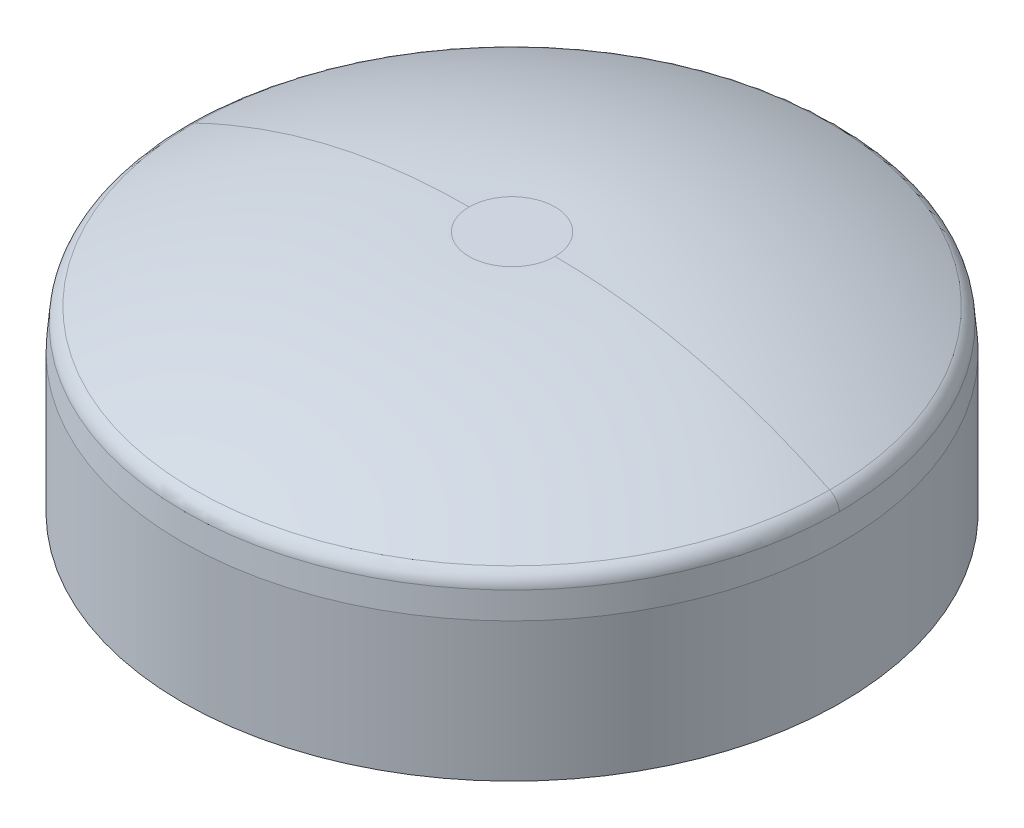
ISO-10303-21;
HEADER;
FILE_DESCRIPTION(('STEP AP214'),'2;1');
FILE_NAME('part.step','',(''),(''),'','','');
FILE_SCHEMA(('AUTOMOTIVE_DESIGN { 1 0 10303 214 1 1 1 1 }'));
ENDSEC;
DATA;
#1=APPLICATION_CONTEXT('core data for automotive mechanical design processes');
#2=APPLICATION_PROTOCOL_DEFINITION('international standard','automotive_design',2000,#1);
#3=PRODUCT_CONTEXT('',#1,'mechanical');
#4=PRODUCT('Part','Part','',(#3));
#5=PRODUCT_RELATED_PRODUCT_CATEGORY('part','',(#4));
#6=PRODUCT_DEFINITION_FORMATION('','',#4);
#7=PRODUCT_DEFINITION_CONTEXT('part definition',#1,'design');
#8=PRODUCT_DEFINITION('design','',#6,#7);
#9=PRODUCT_DEFINITION_SHAPE('','',#8);
#10=(LENGTH_UNIT() NAMED_UNIT(*) SI_UNIT(.MILLI.,.METRE.));
#11=(NAMED_UNIT(*) PLANE_ANGLE_UNIT() SI_UNIT($,.RADIAN.));
#12=(NAMED_UNIT(*) SI_UNIT($,.STERADIAN.) SOLID_ANGLE_UNIT());
#13=UNCERTAINTY_MEASURE_WITH_UNIT(LENGTH_MEASURE(1.E-05),#10,'distance_accuracy_value','');
#14=(GEOMETRIC_REPRESENTATION_CONTEXT(3) GLOBAL_UNCERTAINTY_ASSIGNED_CONTEXT((#13)) GLOBAL_UNIT_ASSIGNED_CONTEXT((#10,
#11,#12)) REPRESENTATION_CONTEXT('',''));
#15=CARTESIAN_POINT('',(0.,0.,0.));
#16=DIRECTION('',(0.,0.,1.));
#17=DIRECTION('',(1.,0.,0.));
#18=AXIS2_PLACEMENT_3D('',#15,#16,#17);
#19=CARTESIAN_POINT('',(-12.82237324978,-24.,169.3590051929));
#20=DIRECTION('',(0.,1.,0.));
#21=DIRECTION('',(0.,0.,1.));
#22=AXIS2_PLACEMENT_3D('',#19,#20,#21);
#23=PLANE('',#22);
#24=CARTESIAN_POINT('',(-104.822373249806,-24.0000000127581,56.3590051930826));
#25=DIRECTION('',(6.513917525063E-12,-1.,-3.70628461016E-10));
#26=DIRECTION('',(0.999999999999995,6.51257786226469E-12,-9.84710912250887E-08));
#27=AXIS2_PLACEMENT_3D('',#24,#25,#26);
#28=CIRCLE('',#27,1.23753227060622);
#29=CARTESIAN_POINT('',(-103.584840979216,-24.0000000085058,56.3590051521871));
#30=VERTEX_POINT('',#29);
#31=CARTESIAN_POINT('',(-106.059905520337,-24.0000000085091,56.3590051578677));
#32=VERTEX_POINT('',#31);
#33=EDGE_CURVE('E297',#30,#32,#28,.T.);
#34=ORIENTED_EDGE('',*,*,#33,.F.);
#35=CARTESIAN_POINT('',(-104.822373249798,-24.0000000127642,56.3590051926341));
#36=DIRECTION('',(-2.569710696586E-12,-1.,3.636028584331E-10));
#37=DIRECTION('',(-1.,2.57082819638291E-12,5.30039171717061E-10));
#38=AXIS2_PLACEMENT_3D('',#35,#36,#37);
#39=CIRCLE('',#38,1.23753227050245);
#40=EDGE_CURVE('E86',#32,#30,#39,.T.);
#41=ORIENTED_EDGE('',*,*,#40,.F.);
#42=EDGE_LOOP('',(#34,#41));
#43=FACE_BOUND('',#42,.T.);
#44=ADVANCED_FACE('F17',(#43),#23,.T.);
#45=CARTESIAN_POINT('',(-103.6669129941,-24.00018933325,56.35900519323));
#46=CARTESIAN_POINT('',(-103.6395480695,-24.00006306328,56.35900519325));
#47=CARTESIAN_POINT('',(-100.8708979554,-23.99367645042,56.3590051947));
#48=CARTESIAN_POINT('',(-98.17994756486,-24.63421227514,56.35900519634));
#49=CARTESIAN_POINT('',(-95.5917585308,-25.90261987075,56.35900519815));
#50=(BOUNDED_CURVE() B_SPLINE_CURVE(3,(#45,#46,#47,#48,#49),.UNSPECIFIED.,.F.,
.F.) B_SPLINE_CURVE_WITH_KNOTS((4,1,4),(0.,0.009881110702158,1.),
.UNSPECIFIED.) CURVE() GEOMETRIC_REPRESENTATION_ITEM() RATIONAL_B_SPLINE_CURVE((1.,1.,1.,1.,1.)) REPRESENTATION_ITEM(''));
#51=CARTESIAN_POINT('',(-104.8223732498,-24.95137377984,56.35900519298));
#52=DIRECTION('',(2.569710696586E-12,1.,-3.636028584331E-10));
#53=AXIS1_PLACEMENT('',#51,#52);
#54=SURFACE_OF_REVOLUTION('',#50,#53);
#55=ORIENTED_EDGE('',*,*,#40,.T.);
#56=CARTESIAN_POINT('',(-95.6657002463787,-25.8665654701918,56.3590039683499));
#57=CARTESIAN_POINT('',(-95.9835614890786,-25.7123273559992,56.3590040108984));
#58=CARTESIAN_POINT('',(-96.3054629251801,-25.566303363066,56.3590040539838));
#59=CARTESIAN_POINT('',(-96.9517084872916,-25.2939747388173,56.3590041404736));
#60=CARTESIAN_POINT('',(-97.2759401814401,-25.1674029505789,56.3590041838631));
#61=CARTESIAN_POINT('',(-97.9268535749711,-24.9339628057314,56.3590042709622));
#62=CARTESIAN_POINT('',(-98.2534535296672,-24.8268672159984,56.3590043146609));
#63=CARTESIAN_POINT('',(-98.9090608728125,-24.632331215056,56.3590044023729));
#64=CARTESIAN_POINT('',(-99.2380152265647,-24.5447123415413,56.3590044463791));
#65=CARTESIAN_POINT('',(-99.898305284791,-24.3890805343731,56.3590045347026));
#66=CARTESIAN_POINT('',(-100.229612096211,-24.320945211953,56.3590045790161));
#67=CARTESIAN_POINT('',(-100.89458282631,-24.2042176834094,56.359004667951));
#68=CARTESIAN_POINT('',(-101.228236082837,-24.155564808314,56.3590047125711));
#69=CARTESIAN_POINT('',(-101.897881260288,-24.0777534994799,56.3590048021168));
#70=CARTESIAN_POINT('',(-102.233873686867,-24.0485994218849,56.3590048470424));
#71=CARTESIAN_POINT('',(-102.908191800731,-24.0096646366894,56.3590049371987));
#72=CARTESIAN_POINT('',(-103.246521533943,-23.9999538983848,56.3590049824299));
#73=CARTESIAN_POINT('',(-103.5848409792,-24.0000000127501,56.3590050276563));
#74=B_SPLINE_CURVE_WITH_KNOTS('',3,(#56,#57,#58,#59,#60,#61,#62,#63,#64,#65,#66,#67,#68,#69,#70,
#71,#72,#73),.UNSPECIFIED.,.F.,.F.,(4,2,2,2,2,2,2,2,4),(0.,1.05987163455491,2.10355270090094,
3.13414248908296,4.15485954660127,5.16901642217199,6.17999015169606,7.19118966320553,
8.20602160946177),.UNSPECIFIED.);
#75=CARTESIAN_POINT('',(-95.6657042404636,-25.8665737050406,56.3590039996265));
#76=VERTEX_POINT('',#75);
#77=EDGE_CURVE('E102',#76,#30,#74,.T.);
#78=ORIENTED_EDGE('',*,*,#77,.F.);
#79=CARTESIAN_POINT('',(-95.6657002403706,-25.8665654578078,56.3590051980983));
#80=CARTESIAN_POINT('',(-95.6656973948198,-25.8665668382302,56.3470180650651));
#81=CARTESIAN_POINT('',(-95.6657180883203,-25.8665682186528,56.3350309264453));
#82=CARTESIAN_POINT('',(-95.6658065525291,-25.8665709794993,56.311056811745));
#83=CARTESIAN_POINT('',(-95.6658743232815,-25.8665723599234,56.2990698356646));
#84=CARTESIAN_POINT('',(-95.6660569411903,-25.866575120773,56.275096230931));
#85=CARTESIAN_POINT('',(-95.6661717883906,-25.8665765011986,56.2631096022781));
#86=CARTESIAN_POINT('',(-95.6664485574699,-25.8665792620513,56.2391368772819));
#87=CARTESIAN_POINT('',(-95.6666104793927,-25.8665806424785,56.2271507809389));
#88=CARTESIAN_POINT('',(-95.6669813955212,-25.8665834033342,56.2031793054371));
#89=CARTESIAN_POINT('',(-95.6671903897707,-25.8665847837629,56.1911939262789));
#90=CARTESIAN_POINT('',(-95.6676554474028,-25.8665875446217,56.1672240700098));
#91=CARTESIAN_POINT('',(-95.6679115108293,-25.8665889250519,56.1552395928999));
#92=CARTESIAN_POINT('',(-95.6684707029956,-25.8665916859138,56.1312717255789));
#93=CARTESIAN_POINT('',(-95.6687738317792,-25.8665930663455,56.1192883353688));
#94=CARTESIAN_POINT('',(-95.6694271499185,-25.8665958272104,56.0953228266769));
#95=CARTESIAN_POINT('',(-95.669777339318,-25.8665972076437,56.0833407081964));
#96=CARTESIAN_POINT('',(-95.6701510564586,-25.866598588077,56.0713593235799));
#97=B_SPLINE_CURVE_WITH_KNOTS('',3,(#79,#80,#81,#82,#83,#84,#85,#86,#87,#88,#89,#90,#91,#92,#93,
#94,#95,#96),.UNSPECIFIED.,.F.,.F.,(4,2,2,2,2,2,2,2,4),(0.,0.0359613772386024,
0.0719227880019081,0.107884232289917,0.143845710102624,0.179807221440025,0.215768766302114,
0.25173034468889,0.287691956600357),.UNSPECIFIED.);
#98=CARTESIAN_POINT('',(-95.670140011298,-25.8665753712645,56.0713589761788));
#99=VERTEX_POINT('',#98);
#100=EDGE_CURVE('E71',#76,#99,#97,.T.);
#101=ORIENTED_EDGE('',*,*,#100,.T.);
#102=CARTESIAN_POINT('',(-104.822373134536,-25.866549029672,56.3589938591116));
#103=DIRECTION('',(5.0998655764031E-08,-0.99999999992952,1.18725753794502E-05));
#104=DIRECTION('',(-0.99999999999939,-5.09855588366651E-08,1.10313565425801E-06));
#105=AXIS2_PLACEMENT_3D('',#102,#103,#104);
#106=CIRCLE('',#105,9.15676255837184);
#107=CARTESIAN_POINT('',(-113.979109670933,-25.8666063214221,56.3590039971683));
#108=VERTEX_POINT('',#107);
#109=EDGE_CURVE('E84',#108,#99,#106,.T.);
#110=ORIENTED_EDGE('',*,*,#109,.F.);
#111=CARTESIAN_POINT('',(-106.059905520412,-24.0000000127662,56.3590051924277));
#112=CARTESIAN_POINT('',(-106.398227864934,-23.999953896785,56.3590051922504));
#113=CARTESIAN_POINT('',(-106.736560497632,-24.0096648023086,56.3590051920693));
#114=CARTESIAN_POINT('',(-107.410884370189,-24.0486002572147,56.3590051917009));
#115=CARTESIAN_POINT('',(-107.746879656081,-24.0777548360586,56.3590051915135));
#116=CARTESIAN_POINT('',(-108.416530511888,-24.1555674823072,56.3590051911327));
#117=CARTESIAN_POINT('',(-108.750186587344,-24.2042211945877,56.3590051909393));
#118=CARTESIAN_POINT('',(-109.415162915306,-24.3209507296143,56.3590051905462));
#119=CARTESIAN_POINT('',(-109.746472505001,-24.3890872245404,56.3590051903466));
#120=CARTESIAN_POINT('',(-110.406768080368,-24.5447217068034,56.3590051899415));
#121=CARTESIAN_POINT('',(-110.735725171504,-24.6323420880992,56.3590051897359));
#122=CARTESIAN_POINT('',(-111.391337950982,-24.8268814327427,56.3590051893188));
#123=CARTESIAN_POINT('',(-111.717940602114,-24.9339788652591,56.3590051891073));
#124=CARTESIAN_POINT('',(-112.368859350778,-25.1674230222407,56.3590051886784));
#125=CARTESIAN_POINT('',(-112.693093699952,-25.2939969879864,56.359005188461));
#126=CARTESIAN_POINT('',(-113.339344536965,-25.5663302927161,56.3590051880205));
#127=CARTESIAN_POINT('',(-113.661248588126,-25.7123567976597,56.3590051877974));
#128=CARTESIAN_POINT('',(-113.979112352074,-25.8665975375128,56.3590051875734));
#129=B_SPLINE_CURVE_WITH_KNOTS('',3,(#111,#112,#113,#114,#115,#116,#117,#118,#119,#120,#121,
#122,#123,#124,#125,#126,#127,#128),.UNSPECIFIED.,.F.,.F.,(4,2,2,2,2,2,2,2,4),(0.,
1.01484064068061,2.02604881339111,3.03703125888376,4.05119699266849,5.07192313616448,
6.10252232032214,7.14621317047218,8.20609504922588),.UNSPECIFIED.);
#130=EDGE_CURVE('E264',#32,#108,#129,.T.);
#131=ORIENTED_EDGE('',*,*,#130,.F.);
#132=EDGE_LOOP('',(#55,#78,#101,#110,#131));
#133=FACE_BOUND('',#132,.T.);
#134=ADVANCED_FACE('F104',(#133),#54,.F.);
#135=CARTESIAN_POINT('',(-105.9778328185,-24.00018933647,56.35900519248));
#136=CARTESIAN_POINT('',(-106.0051979722,-24.00006306435,56.35900519246));
#137=CARTESIAN_POINT('',(-108.7738566148,-23.9936763768,56.35900519102));
#138=CARTESIAN_POINT('',(-111.4648153671,-24.63421626762,56.35900518937));
#139=CARTESIAN_POINT('',(-114.0530123856,-25.90263184802,56.35900518755));
#140=(BOUNDED_CURVE() B_SPLINE_CURVE(3,(#135,#136,#137,#138,#139),.UNSPECIFIED.,.F.,
.F.) B_SPLINE_CURVE_WITH_KNOTS((4,1,4),(0.,0.009881162982011,1.),
.UNSPECIFIED.) CURVE() GEOMETRIC_REPRESENTATION_ITEM() RATIONAL_B_SPLINE_CURVE((1.,1.,1.,1.,1.)) REPRESENTATION_ITEM(''));
#141=CARTESIAN_POINT('',(-104.8223732498,-24.9513738218,56.35900519273));
#142=DIRECTION('',(-6.513917525063E-12,1.,3.70628461016E-10));
#143=AXIS1_PLACEMENT('',#141,#142);
#144=SURFACE_OF_REVOLUTION('',#140,#143);
#145=CARTESIAN_POINT('',(-95.6657296152279,-25.8666259635535,56.359003969138));
#146=CARTESIAN_POINT('',(-95.6657259803936,-25.8666242165757,56.5073310720483));
#147=CARTESIAN_POINT('',(-95.6693324287154,-25.8666224693866,56.6556579318961));
#148=CARTESIAN_POINT('',(-95.6837435718316,-25.8666189791242,56.9519616125187));
#149=CARTESIAN_POINT('',(-95.6945482674908,-25.8666172360509,57.0999384332515));
#150=CARTESIAN_POINT('',(-95.7233339871613,-25.8666137585579,57.3951924646238));
#151=CARTESIAN_POINT('',(-95.7413150120348,-25.8666120241382,57.5424696751793));
#152=CARTESIAN_POINT('',(-95.784409973471,-25.8666085684677,57.8359767884855));
#153=CARTESIAN_POINT('',(-95.8095239108905,-25.8666068472168,57.9822066911104));
#154=CARTESIAN_POINT('',(-95.8668256591019,-25.8666034223685,58.2732739042647));
#155=CARTESIAN_POINT('',(-95.8990134707436,-25.8666017187711,58.4181112146269));
#156=CARTESIAN_POINT('',(-95.9703868995828,-25.8665983336725,58.706051262912));
#157=CARTESIAN_POINT('',(-96.0095725176211,-25.8665966521713,58.8491540006266));
#158=CARTESIAN_POINT('',(-96.0948490561232,-25.8665933156558,59.1332870145247));
#159=CARTESIAN_POINT('',(-96.1409399774166,-25.8665916606415,59.2743172904592));
#160=CARTESIAN_POINT('',(-96.2399182913084,-25.8665883814279,59.5539723861698));
#161=CARTESIAN_POINT('',(-96.2928056847232,-25.8665867572286,59.6925972056568));
#162=CARTESIAN_POINT('',(-96.4052520704757,-25.8665835439004,59.967114073115));
#163=CARTESIAN_POINT('',(-96.4648110636147,-25.8665819547716,60.1030061207579));
#164=CARTESIAN_POINT('',(-96.5904600220356,-25.8665788157568,60.3717365816723));
#165=CARTESIAN_POINT('',(-96.6565499881019,-25.8665772658708,60.504574994577));
#166=CARTESIAN_POINT('',(-96.7951048453743,-25.8665742094219,60.7668845331659));
#167=CARTESIAN_POINT('',(-96.8675697373462,-25.8665727028588,60.8963556584456));
#168=CARTESIAN_POINT('',(-97.0187033470786,-25.8665697370332,61.1516249195549));
#169=CARTESIAN_POINT('',(-97.0973720655844,-25.8665682777707,61.2774230549432));
#170=CARTESIAN_POINT('',(-97.2607275808276,-25.866565410412,61.525049306464));
#171=CARTESIAN_POINT('',(-97.345414378288,-25.8665640023159,61.6468774221196));
#172=CARTESIAN_POINT('',(-97.5206060942115,-25.8665612410352,61.8862759781312));
#173=CARTESIAN_POINT('',(-97.6111110133736,-25.8665598878506,62.0038464179758));
#174=CARTESIAN_POINT('',(-97.7977252779375,-25.8665572400086,62.2344520192859));
#175=CARTESIAN_POINT('',(-97.8938346240127,-25.866555945351,62.3474871802065));
#176=CARTESIAN_POINT('',(-98.0914308146662,-25.8665534180404,62.5687553290199));
#177=CARTESIAN_POINT('',(-98.1929176598905,-25.8665521853872,62.6769883163358));
#178=CARTESIAN_POINT('',(-98.401029223941,-25.8665497854161,62.8883965619039));
#179=CARTESIAN_POINT('',(-98.5076539433844,-25.8665486180981,62.9915718195486));
#180=CARTESIAN_POINT('',(-98.7257894995959,-25.8665463519741,63.1926209917621));
#181=CARTESIAN_POINT('',(-98.8373003369509,-25.866545253168,63.290494905694));
#182=CARTESIAN_POINT('',(-99.0649448357651,-25.8665431270826,63.4807102937065));
#183=CARTESIAN_POINT('',(-99.1810784977795,-25.8665420998033,63.5730517671224));
#184=CARTESIAN_POINT('',(-99.4176944374222,-25.8665401196173,63.7519842402224));
#185=CARTESIAN_POINT('',(-99.5381767155728,-25.8665391667106,63.8385752392157));
#186=CARTESIAN_POINT('',(-99.7832054111738,-25.8665373379404,64.0058023073006));
#187=CARTESIAN_POINT('',(-99.9077518291125,-25.8665364620768,64.0864383756767));
#188=CARTESIAN_POINT('',(-100.160614731843,-25.8665347898813,64.2415651868235));
#189=CARTESIAN_POINT('',(-100.288931217087,-25.8665339935493,64.3160559288558));
#190=CARTESIAN_POINT('',(-100.549031280197,-25.8665324827175,64.4587162016348));
#191=CARTESIAN_POINT('',(-100.680814858479,-25.8665317682178,64.5268857316221));
#192=CARTESIAN_POINT('',(-100.947537947015,-25.866530423158,64.6567426199513));
#193=CARTESIAN_POINT('',(-101.082477457648,-25.8665297925979,64.7184299775145));
#194=CARTESIAN_POINT('',(-101.355193798515,-25.8665286173268,64.8351768660123));
#195=CARTESIAN_POINT('',(-101.49297062909,-25.8665280726158,64.8902363961508));
#196=CARTESIAN_POINT('',(-101.771036298042,-25.8665270707493,64.9935976241103));
#197=CARTESIAN_POINT('',(-101.911325136721,-25.8665266135938,65.0418993211195));
#198=CARTESIAN_POINT('',(-102.194083578762,-25.8665257883383,65.1316308333932));
#199=CARTESIAN_POINT('',(-102.336553182386,-25.8665254202383,65.1730606478322));
#200=CARTESIAN_POINT('',(-102.623336761994,-25.8665247743832,65.2489505710923));
#201=CARTESIAN_POINT('',(-102.7676507382,-25.8665244966282,65.283410679076));
#202=CARTESIAN_POINT('',(-103.057782315718,-25.8665240325394,65.3452798220875));
#203=CARTESIAN_POINT('',(-103.203599917212,-25.8665238462056,65.3726888562682));
#204=CARTESIAN_POINT('',(-103.496394447677,-25.8665235658198,65.4203911329954));
#205=CARTESIAN_POINT('',(-103.643371376788,-25.8665234717677,65.4406843746871));
#206=CARTESIAN_POINT('',(-103.938137527425,-25.8665233765877,65.4741071492335));
#207=CARTESIAN_POINT('',(-104.085926749049,-25.8665233754598,65.4872366812275));
#208=CARTESIAN_POINT('',(-104.381968531617,-25.8665234665513,65.5063010337944));
#209=CARTESIAN_POINT('',(-104.530221092617,-25.8665235587707,65.512235853503));
#210=CARTESIAN_POINT('',(-104.826839506741,-25.8665238367595,65.5168967667397));
#211=CARTESIAN_POINT('',(-104.975205359878,-25.8665240225289,65.5156228594019));
#212=CARTESIAN_POINT('',(-105.271700043498,-25.8665244875995,65.5058693247069));
#213=CARTESIAN_POINT('',(-105.419828873952,-25.8665247669007,65.4973896964841));
#214=CARTESIAN_POINT('',(-105.715499756988,-25.8665254187959,65.473244740006));
#215=CARTESIAN_POINT('',(-105.863041809499,-25.8665257913899,65.4575794108876));
#216=CARTESIAN_POINT('',(-106.157190766823,-25.8665266294114,65.4191000391653));
#217=CARTESIAN_POINT('',(-106.303797671523,-25.866527094839,65.3962859957027));
#218=CARTESIAN_POINT('',(-106.595730171343,-25.866528117849,65.3435630610721));
#219=CARTESIAN_POINT('',(-106.741055766309,-25.8665286754316,65.3136541690517));
#220=CARTESIAN_POINT('',(-107.030082510066,-25.8665298818555,65.2468121551371));
#221=CARTESIAN_POINT('',(-107.173783658663,-25.866530530697,65.209879032399));
#222=CARTESIAN_POINT('',(-107.459222208577,-25.8665319185273,65.1290757601965));
#223=CARTESIAN_POINT('',(-107.600959609658,-25.8665326575162,65.0852056098987));
#224=CARTESIAN_POINT('',(-107.882136000065,-25.8665342243168,64.9906318651439));
#225=CARTESIAN_POINT('',(-108.021574989115,-25.8665350521286,64.9399282698659));
#226=CARTESIAN_POINT('',(-108.297825317813,-25.8665367950411,64.8318073525671));
#227=CARTESIAN_POINT('',(-108.434636657145,-25.8665377101418,64.7743900297397));
#228=CARTESIAN_POINT('',(-108.70530865297,-25.8665396258917,64.6529772269398));
#229=CARTESIAN_POINT('',(-108.839169309107,-25.866540626541,64.5889817461771));
#230=CARTESIAN_POINT('',(-109.103623872047,-25.8665427114459,64.4545637291888));
#231=CARTESIAN_POINT('',(-109.234217778458,-25.8665437957016,64.3841411921912));
#232=CARTESIAN_POINT('',(-109.491830488676,-25.8665460456797,64.2370353397291));
#233=CARTESIAN_POINT('',(-109.618849292055,-25.8665472114022,64.1603520235125));
#234=CARTESIAN_POINT('',(-109.869011884242,-25.8665496219819,64.0009056723197));
#235=CARTESIAN_POINT('',(-109.992155672585,-25.8665508668391,63.9181426366131));
#236=CARTESIAN_POINT('',(-110.234277472172,-25.8665534331695,63.7467322613527));
#237=CARTESIAN_POINT('',(-110.353255482915,-25.8665547546427,63.6580849210919));
#238=CARTESIAN_POINT('',(-110.586764800753,-25.8665574715053,63.4751152454384));
#239=CARTESIAN_POINT('',(-110.701296107313,-25.8665588668948,63.3807929093639));
#240=CARTESIAN_POINT('',(-110.925641589523,-25.8665617287156,63.1866959503949));
#241=CARTESIAN_POINT('',(-111.035455764607,-25.866563195147,63.0869213268453));
#242=CARTESIAN_POINT('',(-111.250107694421,-25.8665661960097,62.8821553749881));
#243=CARTESIAN_POINT('',(-111.354945448553,-25.8665677304411,62.7771640460539));
#244=CARTESIAN_POINT('',(-111.559396997058,-25.8665708641013,62.5622125829972));
#245=CARTESIAN_POINT('',(-111.659010790803,-25.8665724633301,62.452252448278));
#246=CARTESIAN_POINT('',(-111.852779213652,-25.8665757232296,62.2276230054025));
#247=CARTESIAN_POINT('',(-111.946933842099,-25.8665773839002,62.1129536966805));
#248=CARTESIAN_POINT('',(-112.129561619349,-25.8665807631829,61.879176656704));
#249=CARTESIAN_POINT('',(-112.218034767468,-25.8665824817948,61.7600689249161));
#250=CARTESIAN_POINT('',(-112.389090683861,-25.8665859733225,61.5176962695826));
#251=CARTESIAN_POINT('',(-112.471673451427,-25.8665877462383,61.3944313455376));
#252=CARTESIAN_POINT('',(-112.630753614572,-25.866591342608,61.1440353523089));
#253=CARTESIAN_POINT('',(-112.70725100942,-25.8665931660619,61.0169042826609));
#254=CARTESIAN_POINT('',(-112.853979803419,-25.866596859623,60.7590761734829));
#255=CARTESIAN_POINT('',(-112.924211201818,-25.8665987297302,60.6283791335245));
#256=CARTESIAN_POINT('',(-113.058242174276,-25.8666025126026,60.3637276788732));
#257=CARTESIAN_POINT('',(-113.122041747562,-25.8666044253679,60.2297732637891));
#258=CARTESIAN_POINT('',(-113.243058427201,-25.8666082894606,59.9589233452404));
#259=CARTESIAN_POINT('',(-113.300275532762,-25.8666102407881,59.8220278414225));
#260=CARTESIAN_POINT('',(-113.407992178228,-25.8666141778183,59.5456189763379));
#261=CARTESIAN_POINT('',(-113.458491717326,-25.8666161635212,59.4061056147568));
#262=CARTESIAN_POINT('',(-113.55265398605,-25.8666201650341,59.1247904458204));
#263=CARTESIAN_POINT('',(-113.596316714856,-25.8666221808441,58.9829886381903));
#264=CARTESIAN_POINT('',(-113.67670228535,-25.8666262382324,58.6974313941643));
#265=CARTESIAN_POINT('',(-113.713425126205,-25.8666282798106,58.5536759575338));
#266=CARTESIAN_POINT('',(-113.779844141847,-25.8666323843352,58.2645508784068));
#267=CARTESIAN_POINT('',(-113.809540315789,-25.8666344472816,58.1191812357164));
#268=CARTESIAN_POINT('',(-113.861836135996,-25.8666385900918,57.8271710050057));
#269=CARTESIAN_POINT('',(-113.884435781408,-25.8666406699556,57.6805304168328));
#270=CARTESIAN_POINT('',(-113.922484221119,-25.8666448421114,57.3863244590303));
#271=CARTESIAN_POINT('',(-113.937933014558,-25.8666469344034,57.2387590892895));
#272=CARTESIAN_POINT('',(-113.96164685609,-25.8666511268918,56.943052280277));
#273=CARTESIAN_POINT('',(-113.96991190332,-25.8666532270882,56.7949108409361));
#274=CARTESIAN_POINT('',(-113.974568630466,-25.8666553289749,56.6466557318231));
#275=B_SPLINE_CURVE_WITH_KNOTS('',3,(#145,#146,#147,#148,#149,#150,#151,#152,#153,#154,#155,
#156,#157,#158,#159,#160,#161,#162,#163,#164,#165,#166,#167,#168,#169,#170,#171,#172,#173,#174,
#175,#176,#177,#178,#179,#180,#181,#182,#183,#184,#185,#186,#187,#188,#189,#190,#191,#192,#193,
#194,#195,#196,#197,#198,#199,#200,#201,#202,#203,#204,#205,#206,#207,#208,#209,#210,#211,#212,
#213,#214,#215,#216,#217,#218,#219,#220,#221,#222,#223,#224,#225,#226,#227,#228,#229,#230,#231,
#232,#233,#234,#235,#236,#237,#238,#239,#240,#241,#242,#243,#244,#245,#246,#247,#248,#249,#250,
#251,#252,#253,#254,#255,#256,#257,#258,#259,#260,#261,#262,#263,#264,#265,#266,#267,#268,#269,
#270,#271,#272,#273,#274),.UNSPECIFIED.,.F.,.F.,(4,2,2,2,2,2,2,2,2,2,2,2,2,2,2,2,2,2,2,2,2,2,2,
2,2,2,2,2,2,2,2,2,2,2,2,2,2,2,2,2,2,2,2,2,2,2,2,2,2,2,2,2,2,2,2,2,2,2,2,2,2,2,2,2,4),(0.,
0.444937091882204,0.889874237218907,1.33481143601005,1.77974868825555,2.22468599395536,
2.66962335310942,3.11456076571765,3.55949823178001,4.00443575129642,4.44937332426682,
4.89431095069114,5.33924863056931,5.78418636390131,6.22912415068701,6.67406199092641,
7.11899988461941,7.56393783176596,8.00887583236598,8.45381388641944,8.89875199392624,
9.34369015488631,9.78862836929964,10.2335666371661,10.6785049584857,11.1234433332583,
11.5683817614839,12.0133202431624,12.4582587782938,12.9031973668779,13.3481360089148,
13.7930747044043,14.2380134533464,14.682952255741,15.1278911115881,15.5728300208876,
16.0177689836395,16.4627079998436,16.9076470694999,17.3525861926084,17.7975253691689,
18.2424645991815,18.6874038826461,19.1323432195625,19.5772826099308,20.0222220537508,
20.4671615510226,20.9121011017459,21.3570407059209,21.8019803635474,22.2469200746253,
22.6918598391546,23.1367996571352,23.5817395285671,24.0266794534502,24.4716194317845,
24.9165594635697,25.361499548806,25.8064396874933,26.2513798796314,26.6963201252203,
27.14126042426,27.5862007767504,28.0311411826914,28.4760816420829),.UNSPECIFIED.);
#276=CARTESIAN_POINT('',(-113.974581590765,-25.8666267683767,56.646656138777));
#277=VERTEX_POINT('',#276);
#278=EDGE_CURVE('E94',#76,#277,#275,.T.);
#279=ORIENTED_EDGE('',*,*,#278,.F.);
#280=ORIENTED_EDGE('',*,*,#77,.T.);
#281=ORIENTED_EDGE('',*,*,#33,.T.);
#282=ORIENTED_EDGE('',*,*,#130,.T.);
#283=CARTESIAN_POINT('',(-104.822373249794,-25.8665975374531,56.3590051923908));
#284=DIRECTION('',(-6.513917525063E-12,1.,3.70628461016E-10));
#285=DIRECTION('',(-1.,-6.51397089419471E-12,-5.22991688522704E-10));
#286=AXIS2_PLACEMENT_3D('',#283,#284,#285);
#287=CIRCLE('',#286,9.15673910228);
#288=EDGE_CURVE('E111',#108,#277,#287,.T.);
#289=ORIENTED_EDGE('',*,*,#288,.T.);
#290=EDGE_LOOP('',(#279,#280,#281,#282,#289));
#291=FACE_BOUND('',#290,.T.);
#292=ADVANCED_FACE('F115',(#291),#144,.F.);
#293=CARTESIAN_POINT('',(-104.8223731116,-26.31628535645,56.35899919864));
#294=DIRECTION('',(-5.0998655764031E-08,0.99999999992952,-1.18725753794502E-05));
#295=DIRECTION('',(-0.99950651109874,3.21971728575085E-07,0.0314123267384211));
#296=AXIS2_PLACEMENT_3D('',#293,#294,#295);
#297=TOROIDAL_SURFACE('',#296,8.938275091027,0.4999995370388);
#298=CARTESIAN_POINT('',(-104.822373113822,-26.2727245296548,56.3589986814608));
#299=DIRECTION('',(-5.0998655764031E-08,0.99999999992952,-1.18725753794502E-05));
#300=DIRECTION('',(0.999506511096033,-3.21971729491601E-07,-0.0314123268245597));
#301=AXIS2_PLACEMENT_3D('',#298,#299,#300);
#302=CIRCLE('',#301,9.4363734662579);
#303=CARTESIAN_POINT('',(-104.8223732498,-26.2728365000765,46.9226244885346));
#304=VERTEX_POINT('',#303);
#305=CARTESIAN_POINT('',(-95.3906570213136,-26.2727276228835,56.062580253842));
#306=VERTEX_POINT('',#305);
#307=EDGE_CURVE('E217',#304,#306,#302,.F.);
#308=ORIENTED_EDGE('',*,*,#307,.F.);
#309=CARTESIAN_POINT('',(-104.8223732498,-26.2728365637098,46.922625215868));
#310=CARTESIAN_POINT('',(-104.976775782769,-26.2728381262622,46.9226218068865));
#311=CARTESIAN_POINT('',(-105.131178040317,-26.2728396437463,46.9264144382197));
#312=CARTESIAN_POINT('',(-105.439610748799,-26.2728425888387,46.9415682645383));
#313=CARTESIAN_POINT('',(-105.593641199718,-26.2728440164468,46.9529294598508));
#314=CARTESIAN_POINT('',(-105.900959032407,-26.2728467820473,46.9831968978012));
#315=CARTESIAN_POINT('',(-106.054246414144,-26.2728481200397,47.002103140765));
#316=CARTESIAN_POINT('',(-106.359708876043,-26.2728507069428,47.0474140953799));
#317=CARTESIAN_POINT('',(-106.511883956156,-26.2728519558536,47.073818807355));
#318=CARTESIAN_POINT('',(-106.81475519767,-26.2728543653268,47.1340633659596));
#319=CARTESIAN_POINT('',(-106.965451359006,-26.2728555258892,47.1679032129104));
#320=CARTESIAN_POINT('',(-107.265001725878,-26.2728577596159,47.2429364447485));
#321=CARTESIAN_POINT('',(-107.413855931334,-26.2728588327803,47.2841298299535));
#322=CARTESIAN_POINT('',(-107.709363782146,-26.2728608928705,47.373770920229));
#323=CARTESIAN_POINT('',(-107.856017427407,-26.2728618797964,47.4222186256128));
#324=CARTESIAN_POINT('',(-108.146770856082,-26.2728637687775,47.5262516366724));
#325=CARTESIAN_POINT('',(-108.290870639386,-26.2728646708328,47.5818369426565));
#326=CARTESIAN_POINT('',(-108.576169194525,-26.2728663916447,47.7000112469595));
#327=CARTESIAN_POINT('',(-108.717367966233,-26.2728672104014,47.7626002455809));
#328=CARTESIAN_POINT('',(-108.996524337412,-26.272868766389,47.8946311528563));
#329=CARTESIAN_POINT('',(-109.134481936742,-26.27286950362,47.9640730618063));
#330=CARTESIAN_POINT('',(-109.406823610618,-26.2728708985254,48.1096424986311));
#331=CARTESIAN_POINT('',(-109.54120768501,-26.2728715561999,48.1857700267945));
#332=CARTESIAN_POINT('',(-109.806078565384,-26.2728727941533,48.3445273045361));
#333=CARTESIAN_POINT('',(-109.936565371199,-26.2728733744322,48.4271570543951));
#334=CARTESIAN_POINT('',(-110.193327359634,-26.2728744599416,48.5987197135999));
#335=CARTESIAN_POINT('',(-110.319602542074,-26.2728749651723,48.6876526232179));
#336=CARTESIAN_POINT('',(-110.567637075129,-26.2728759031134,48.8716073551079));
#337=CARTESIAN_POINT('',(-110.689396425549,-26.2728763358239,48.9666291776427));
#338=CARTESIAN_POINT('',(-110.928105964952,-26.2728771314277,49.1625328197787));
#339=CARTESIAN_POINT('',(-111.045056153728,-26.272877494321,49.2634146396328));
#340=CARTESIAN_POINT('',(-111.273865625907,-26.2728781531613,49.4707952435388));
#341=CARTESIAN_POINT('',(-111.385724909091,-26.2728784491084,49.5772940278331));
#342=CARTESIAN_POINT('',(-111.604083090578,-26.2728789770887,49.7956519959576));
#343=CARTESIAN_POINT('',(-111.710581988649,-26.2728792091219,49.9075111800192));
#344=CARTESIAN_POINT('',(-111.917962834027,-26.2728796124608,50.1363204693094));
#345=CARTESIAN_POINT('',(-112.018844781091,-26.2728797837665,50.2532705747576));
#346=CARTESIAN_POINT('',(-112.214748690288,-26.2728800689829,50.4919799639414));
#347=CARTESIAN_POINT('',(-112.309770652169,-26.2728801828937,50.6137392478844));
#348=CARTESIAN_POINT('',(-112.493725674045,-26.2728803567912,50.8617736654104));
#349=CARTESIAN_POINT('',(-112.582658733777,-26.272880416778,50.9880487991882));
#350=CARTESIAN_POINT('',(-112.754221703094,-26.2728804864282,51.2448107086228));
#351=CARTESIAN_POINT('',(-112.836851612405,-26.2728804960918,51.3752974844612));
#352=CARTESIAN_POINT('',(-112.995609217462,-26.2728804688177,51.640168324005));
#353=CARTESIAN_POINT('',(-113.071736912927,-26.27288043188,51.7745523878785));
#354=CARTESIAN_POINT('',(-113.217306691238,-26.2728803152378,52.0468940605377));
#355=CARTESIAN_POINT('',(-113.286748773797,-26.2728802355333,52.1848516694774));
#356=CARTESIAN_POINT('',(-113.418780033602,-26.2728800372947,52.4640080802887));
#357=CARTESIAN_POINT('',(-113.481369210553,-26.2728799187607,52.6052068822999));
#358=CARTESIAN_POINT('',(-113.599543875214,-26.2728796468939,52.8905055189431));
#359=CARTESIAN_POINT('',(-113.655129362623,-26.2728794935613,53.0346053537003));
#360=CARTESIAN_POINT('',(-113.759162738585,-26.272879156212,53.3253589065575));
#361=CARTESIAN_POINT('',(-113.807610626832,-26.2728789721954,53.4720126247677));
#362=CARTESIAN_POINT('',(-113.897252083213,-26.2728785776669,53.7675206430201));
#363=CARTESIAN_POINT('',(-113.938445651035,-26.272878367155,53.9163749431571));
#364=CARTESIAN_POINT('',(-114.013479246798,-26.2728779238885,54.2159255210846));
#365=CARTESIAN_POINT('',(-114.047319274421,-26.2728776911339,54.3666217989544));
#366=CARTESIAN_POINT('',(-114.107564191354,-26.2728772076879,54.6694932952653));
#367=CARTESIAN_POINT('',(-114.133969080344,-26.2728769569965,54.8216685137701));
#368=CARTESIAN_POINT('',(-114.179280384263,-26.2728764420264,55.1271312741051));
#369=CARTESIAN_POINT('',(-114.19818679887,-26.2728761777477,55.2804188159831));
#370=CARTESIAN_POINT('',(-114.228454573672,-26.2728756399845,55.5877369904085));
#371=CARTESIAN_POINT('',(-114.239815933542,-26.2728753664999,55.7417676229879));
#372=CARTESIAN_POINT('',(-114.254970080849,-26.2728748147314,56.0502007159531));
#373=CARTESIAN_POINT('',(-114.258762867959,-26.2728745364476,56.2046031763549));
#374=CARTESIAN_POINT('',(-114.258759609839,-26.2728742579674,56.3590059158549));
#375=B_SPLINE_CURVE_WITH_KNOTS('',3,(#309,#310,#311,#312,#313,#314,#315,#316,#317,#318,#319,
#320,#321,#322,#323,#324,#325,#326,#327,#328,#329,#330,#331,#332,#333,#334,#335,#336,#337,#338,
#339,#340,#341,#342,#343,#344,#345,#346,#347,#348,#349,#350,#351,#352,#353,#354,#355,#356,#357,
#358,#359,#360,#361,#362,#363,#364,#365,#366,#367,#368,#369,#370,#371,#372,#373,#374),
.UNSPECIFIED.,.F.,.F.,(4,2,2,2,2,2,2,2,2,2,2,2,2,2,2,2,2,2,2,2,2,2,2,2,2,2,2,2,2,2,2,2,4),(0.,
0.463160627061759,0.926321274141121,1.38948194123589,1.85264262834396,2.31580333546315,
2.77896406259136,3.24212480972641,3.70528557686618,4.16844636400852,4.63160717115128,
5.09476799829231,5.55792884542948,6.02108971256064,6.48425059968368,6.9474115067964,
7.4105724338967,7.8737333809824,8.3368943480514,8.8000553351015,9.26321634213061,
9.72637736913656,10.1895384161172,10.6526994830704,11.1158605699941,11.579021676886,
12.042182803744,12.505343950566,12.9685051173499,13.4316663040934,13.8948275107945,
14.3579887374511,14.8211499840609),.UNSPECIFIED.);
#376=CARTESIAN_POINT('',(-114.25874981052,-26.2728746798238,56.3590059158592));
#377=VERTEX_POINT('',#376);
#378=EDGE_CURVE('E237',#377,#304,#375,.F.);
#379=ORIENTED_EDGE('',*,*,#378,.F.);
#380=CARTESIAN_POINT('',(-113.979084251549,-25.8666574755699,56.3590039616144));
#381=CARTESIAN_POINT('',(-113.983916687575,-25.8690045093654,56.3590039556285));
#382=CARTESIAN_POINT('',(-113.98871126716,-25.8714294825346,56.3590039506623));
#383=CARTESIAN_POINT('',(-113.998219798358,-25.8764326627283,56.3590039427448));
#384=CARTESIAN_POINT('',(-114.00293374997,-25.8790108697527,56.3590039397934));
#385=CARTESIAN_POINT('',(-114.012276110133,-25.8843178727647,56.3590039358808));
#386=CARTESIAN_POINT('',(-114.016904518682,-25.8870466687522,56.3590039349195));
#387=CARTESIAN_POINT('',(-114.026070988946,-25.8926520056927,56.3590039349597));
#388=CARTESIAN_POINT('',(-114.030609050659,-25.8955285466456,56.3590039359611));
#389=CARTESIAN_POINT('',(-114.039590111325,-25.9014263874546,56.3590039398978));
#390=CARTESIAN_POINT('',(-114.044033110277,-25.9044476873108,56.359003942833));
#391=CARTESIAN_POINT('',(-114.052819429869,-25.9106319064095,56.359003950606));
#392=CARTESIAN_POINT('',(-114.057162750509,-25.9137948256521,56.3590039554439));
#393=CARTESIAN_POINT('',(-114.065745201049,-25.9202589976974,56.3590039669894));
#394=CARTESIAN_POINT('',(-114.069984330949,-25.9235602505,56.359003973697));
#395=CARTESIAN_POINT('',(-114.078353995946,-25.9302976599023,56.3590039889473));
#396=CARTESIAN_POINT('',(-114.082484531042,-25.933733816502,56.35900399749));
#397=CARTESIAN_POINT('',(-114.090632715154,-25.940737463641,56.3590040163737));
#398=CARTESIAN_POINT('',(-114.094650364171,-25.9443049541803,56.3590040267147));
#399=CARTESIAN_POINT('',(-114.102568602134,-25.9515675628808,56.3590040491569));
#400=CARTESIAN_POINT('',(-114.106469191082,-25.955262681042,56.359004061258));
#401=CARTESIAN_POINT('',(-114.114149256533,-25.9627767060784,56.3590040871802));
#402=CARTESIAN_POINT('',(-114.117928733037,-25.9665956129537,56.3590041010012));
#403=CARTESIAN_POINT('',(-114.125362647051,-25.9743532479038,56.3590041303214));
#404=CARTESIAN_POINT('',(-114.129017084561,-25.9782919759786,56.3590041458205));
#405=CARTESIAN_POINT('',(-114.136197123943,-25.9862851613297,56.3590041784533));
#406=CARTESIAN_POINT('',(-114.139722725815,-25.9903396186059,56.359004195587));
#407=CARTESIAN_POINT('',(-114.146641431124,-25.9985600501289,56.3590042314439));
#408=CARTESIAN_POINT('',(-114.150034534562,-26.0027260243757,56.3590042501671));
#409=CARTESIAN_POINT('',(-114.156684717861,-26.0111651617523,56.3590042891561));
#410=CARTESIAN_POINT('',(-114.159941797724,-26.0154383248822,56.359004309422));
#411=CARTESIAN_POINT('',(-114.166316550048,-26.0240874005778,56.3590043514483));
#412=CARTESIAN_POINT('',(-114.16943422251,-26.0284633131435,56.3590043732087));
#413=CARTESIAN_POINT('',(-114.175526921042,-26.0373133415155,56.3590044181743));
#414=CARTESIAN_POINT('',(-114.178501947111,-26.0417874573218,56.3590044413794));
#415=CARTESIAN_POINT('',(-114.184306262063,-26.0508292439553,56.3590044891833));
#416=CARTESIAN_POINT('',(-114.187135550945,-26.0553969147825,56.3590045137821));
#417=CARTESIAN_POINT('',(-114.192645452134,-26.0646210660422,56.3590045643206));
#418=CARTESIAN_POINT('',(-114.195326064442,-26.0692775464748,56.3590045902604));
#419=CARTESIAN_POINT('',(-114.200535827558,-26.0786744792645,56.359004643427));
#420=CARTESIAN_POINT('',(-114.203064978367,-26.0834149316215,56.3590046706539));
#421=CARTESIAN_POINT('',(-114.207969190916,-26.0929748833397,56.3590047263396));
#422=CARTESIAN_POINT('',(-114.210344252657,-26.0977943827007,56.3590047547984));
#423=CARTESIAN_POINT('',(-114.214937819586,-26.1075074213834,56.3590048128915));
#424=CARTESIAN_POINT('',(-114.217156324774,-26.1124009607049,56.3590048425258));
#425=CARTESIAN_POINT('',(-114.221434473764,-26.1222569953439,56.3590049029124));
#426=CARTESIAN_POINT('',(-114.223494117565,-26.1272194906613,56.3590049336646));
#427=CARTESIAN_POINT('',(-114.227452403988,-26.1372082816881,56.3590049962283));
#428=CARTESIAN_POINT('',(-114.22935104661,-26.1422345773973,56.3590050280397));
#429=CARTESIAN_POINT('',(-114.232985358147,-26.1523457473211,56.359005092662));
#430=CARTESIAN_POINT('',(-114.234721027061,-26.1574306215355,56.3590051254728));
#431=CARTESIAN_POINT('',(-114.238027587986,-26.167653665723,56.3590051920332));
#432=CARTESIAN_POINT('',(-114.239598479996,-26.172791835696,56.3590052257827));
#433=CARTESIAN_POINT('',(-114.242573855039,-26.1831161332919,56.3590052941586));
#434=CARTESIAN_POINT('',(-114.243978338072,-26.1883022609149,56.359005328785));
#435=CARTESIAN_POINT('',(-114.246619436219,-26.198717085849,56.3590053988522));
#436=CARTESIAN_POINT('',(-114.247856051332,-26.20394578316,56.359005434293));
#437=CARTESIAN_POINT('',(-114.250160128178,-26.2144403153925,56.3590055059254));
#438=CARTESIAN_POINT('',(-114.25122758991,-26.2197061503139,56.3590055421171));
#439=CARTESIAN_POINT('',(-114.253192253701,-26.2302694866943,56.3590056151872));
#440=CARTESIAN_POINT('',(-114.254089455761,-26.2355669881533,56.3590056520656));
#441=CARTESIAN_POINT('',(-114.255712657979,-26.2461881551761,56.3590057264443));
#442=CARTESIAN_POINT('',(-114.256438658137,-26.2515118207399,56.3590057639446));
#443=CARTESIAN_POINT('',(-114.257718740045,-26.2621797806146,56.3590058395015));
#444=CARTESIAN_POINT('',(-114.258272821795,-26.2675240749255,56.3590058775581));
#445=CARTESIAN_POINT('',(-114.258740586088,-26.2728759159311,56.35900591586));
#446=B_SPLINE_CURVE_WITH_KNOTS('',3,(#380,#381,#382,#383,#384,#385,#386,#387,#388,#389,#390,
#391,#392,#393,#394,#395,#396,#397,#398,#399,#400,#401,#402,#403,#404,#405,#406,#407,#408,#409,
#410,#411,#412,#413,#414,#415,#416,#417,#418,#419,#420,#421,#422,#423,#424,#425,#426,#427,#428,
#429,#430,#431,#432,#433,#434,#435,#436,#437,#438,#439,#440,#441,#442,#443,#444,#445),
.UNSPECIFIED.,.F.,.F.,(4,2,2,2,2,2,2,2,2,2,2,2,2,2,2,2,2,2,2,2,2,2,2,2,2,2,2,2,2,2,2,2,4),(0.,
0.0161160312562336,0.0322320625124857,0.0483480937687472,0.0644641250250016,0.0805801562812625,
0.0966961875375187,0.112812218793786,0.128928250050034,0.145044281306298,0.161160312562551,
0.177276343818813,0.193392375075067,0.209508406331331,0.22562443758758,0.241740468843843,
0.257856500100111,0.273972531356377,0.290088562612626,0.306204593868901,0.322320625125161,
0.338436656381425,0.354552687637693,0.370668718893956,0.386784750150212,0.40290078140649,
0.419016812662753,0.43513284391902,0.451248875175281,0.467364906431544,0.483480937687816,
0.499596968944081,0.515713000200346),.UNSPECIFIED.);
#447=EDGE_CURVE('E117',#108,#377,#446,.T.);
#448=ORIENTED_EDGE('',*,*,#447,.F.);
#449=ORIENTED_EDGE('',*,*,#109,.T.);
#450=ORIENTED_EDGE('',*,*,#100,.F.);
#451=CARTESIAN_POINT('',(-95.3860062520467,-26.2728763620897,56.35900591859));
#452=CARTESIAN_POINT('',(-95.3864740900312,-26.2675237542314,56.3590058803339));
#453=CARTESIAN_POINT('',(-95.3870282702389,-26.2621786953416,56.3590058423231));
#454=CARTESIAN_POINT('',(-95.3883085982458,-26.2515092132331,56.359005766858));
#455=CARTESIAN_POINT('',(-95.3890347460449,-26.2461847900143,56.3590057294036));
#456=CARTESIAN_POINT('',(-95.3906582923794,-26.2355621169819,56.3590056551168));
#457=CARTESIAN_POINT('',(-95.3915556909147,-26.2302638671682,56.3590056182844));
#458=CARTESIAN_POINT('',(-95.3935207960153,-26.219699045734,56.3590055453065));
#459=CARTESIAN_POINT('',(-95.3945885025805,-26.2144324741136,56.359005509161));
#460=CARTESIAN_POINT('',(-95.3968931168794,-26.2039364824733,56.3590054376211));
#461=CARTESIAN_POINT('',(-95.398130024613,-26.1987070624536,56.3590054022266));
#462=CARTESIAN_POINT('',(-95.4007717551133,-26.1882908084013,56.3590053322523));
#463=CARTESIAN_POINT('',(-95.4021765778799,-26.1831039743689,56.3590052976723));
#464=CARTESIAN_POINT('',(-95.4051526787328,-26.1727782825324,56.3590052293896));
#465=CARTESIAN_POINT('',(-95.4067239568191,-26.1676394247285,56.3590051956868));
#466=CARTESIAN_POINT('',(-95.4100313353687,-26.1574150257033,56.35900512922));
#467=CARTESIAN_POINT('',(-95.4117674358321,-26.152329484482,56.3590050964561));
#468=CARTESIAN_POINT('',(-95.4154026549743,-26.1422170035772,56.3590050319279));
#469=CARTESIAN_POINT('',(-95.4173017736531,-26.1371900638936,56.3590050001636));
#470=CARTESIAN_POINT('',(-95.4212610556362,-26.1272000101174,56.3590049376945));
#471=CARTESIAN_POINT('',(-95.4233212189406,-26.1222368960248,56.3590049069896));
#472=CARTESIAN_POINT('',(-95.4276004492304,-26.1123796511563,56.3590048466981));
#473=CARTESIAN_POINT('',(-95.4298195162158,-26.1074855203804,56.3590048171114));
#474=CARTESIAN_POINT('',(-95.4344142477874,-26.0977713281825,56.3590047591139));
#475=CARTESIAN_POINT('',(-95.4367899123735,-26.0929512667606,56.359004730703));
#476=CARTESIAN_POINT('',(-95.4416953703285,-26.0833902223342,56.3590046751135));
#477=CARTESIAN_POINT('',(-95.4442251636974,-26.0786492393297,56.3590046479349));
#478=CARTESIAN_POINT('',(-95.4494362502273,-26.0692512786227,56.359004594865));
#479=CARTESIAN_POINT('',(-95.4521175433882,-26.0645943009201,56.3590045689738));
#480=CARTESIAN_POINT('',(-95.4576288430715,-26.0553691904019,56.3590045185327));
#481=CARTESIAN_POINT('',(-95.4604588495938,-26.0508010575863,56.3590044939828));
#482=CARTESIAN_POINT('',(-95.4662646350242,-26.0417583840984,56.359004446277));
#483=CARTESIAN_POINT('',(-95.4692404139323,-26.0372838434261,56.359004423121));
#484=CARTESIAN_POINT('',(-95.4753346516705,-26.0284330042194,56.3590043782542));
#485=CARTESIAN_POINT('',(-95.4784531105005,-26.0240567056849,56.3590043565434));
#486=CARTESIAN_POINT('',(-95.4848294673441,-26.0154068986537,56.3590043146166));
#487=CARTESIAN_POINT('',(-95.4880873653577,-26.011133390157,56.3590042944006));
#488=CARTESIAN_POINT('',(-95.4947392149229,-26.002693604281,56.3590042555118));
#489=CARTESIAN_POINT('',(-95.4981331664747,-25.9985273269015,56.3590042368389));
#490=CARTESIAN_POINT('',(-95.5050535960826,-25.9903063329036,56.3590042010831));
#491=CARTESIAN_POINT('',(-95.5085800741389,-25.986251616285,56.359004184));
#492=CARTESIAN_POINT('',(-95.5157618919991,-25.9782579575172,56.359004151469));
#493=CARTESIAN_POINT('',(-95.5194172318031,-25.9743190153679,56.359004136021));
#494=CARTESIAN_POINT('',(-95.5268529744874,-25.9665609989328,56.3590041068035));
#495=CARTESIAN_POINT('',(-95.5306333773677,-25.962741924647,56.3590040930339));
#496=CARTESIAN_POINT('',(-95.5383153175663,-25.9552276127652,56.3590040672152));
#497=CARTESIAN_POINT('',(-95.5422168548847,-25.9515323751692,56.359004055166));
#498=CARTESIAN_POINT('',(-95.5501370094364,-25.9442695767997,56.3590040328282));
#499=CARTESIAN_POINT('',(-95.5541556266696,-25.9407020160263,56.3590040225395));
#500=CARTESIAN_POINT('',(-95.5623057648594,-25.9336982787558,56.3590040037609));
#501=CARTESIAN_POINT('',(-95.5664372858158,-25.9302621022586,56.3590039952711));
#502=CARTESIAN_POINT('',(-95.5748089379209,-25.9235247044426,56.3590039801268));
#503=CARTESIAN_POINT('',(-95.5790490690697,-25.9202234831237,56.3590039734724));
#504=CARTESIAN_POINT('',(-95.5876335351905,-25.9137594263779,56.3590039620338));
#505=CARTESIAN_POINT('',(-95.5919778701626,-25.9105965909511,56.3590039572497));
#506=CARTESIAN_POINT('',(-95.6007662291558,-25.904412592671,56.3590039495844));
#507=CARTESIAN_POINT('',(-95.6052102531769,-25.9013914298179,56.3590039467034));
#508=CARTESIAN_POINT('',(-95.6141933723277,-25.8954939169602,56.3590039428755));
#509=CARTESIAN_POINT('',(-95.6187324674573,-25.8926175669557,56.3590039419286));
#510=CARTESIAN_POINT('',(-95.6279010104736,-25.8870126665145,56.3590039419981));
#511=CARTESIAN_POINT('',(-95.6325304583603,-25.8842841160779,56.3590039430145));
#512=CARTESIAN_POINT('',(-95.6418749006595,-25.8789776593339,56.3590039470377));
#513=CARTESIAN_POINT('',(-95.6465898950721,-25.8763997530265,56.3590039500446));
#514=CARTESIAN_POINT('',(-95.6561005128393,-25.8713972298671,56.3590039580737));
#515=CARTESIAN_POINT('',(-95.660896136194,-25.868972613015,56.3590039630958));
#516=CARTESIAN_POINT('',(-95.6657296152279,-25.8666259635535,56.359003969138));
#517=B_SPLINE_CURVE_WITH_KNOTS('',3,(#451,#452,#453,#454,#455,#456,#457,#458,#459,#460,#461,
#462,#463,#464,#465,#466,#467,#468,#469,#470,#471,#472,#473,#474,#475,#476,#477,#478,#479,#480,
#481,#482,#483,#484,#485,#486,#487,#488,#489,#490,#491,#492,#493,#494,#495,#496,#497,#498,#499,
#500,#501,#502,#503,#504,#505,#506,#507,#508,#509,#510,#511,#512,#513,#514,#515,#516),
.UNSPECIFIED.,.F.,.F.,(4,2,2,2,2,2,2,2,2,2,2,2,2,2,2,2,2,2,2,2,2,2,2,2,2,2,2,2,2,2,2,2,4),(0.,
0.0161183420241325,0.03223668404826,0.0483550260723861,0.0644733680965124,0.0805917101206417,
0.0967100521447743,0.112828394168901,0.128946736193025,0.145065078217159,0.161183420241284,
0.177301762265408,0.193420104289532,0.209538446313664,0.225656788337787,0.241775130361914,
0.257893472386039,0.274011814410159,0.290130156434289,0.306248498458401,0.322366840482535,
0.338485182506652,0.354603524530771,0.370721866554893,0.386840208579015,0.402958550603133,
0.419076892627246,0.435195234651362,0.451313576675486,0.46743191869961,0.483550260723709,
0.499668602747843,0.515786944771942),.UNSPECIFIED.);
#518=CARTESIAN_POINT('',(-95.3859967822314,-26.2728755885399,56.3590059185887));
#519=VERTEX_POINT('',#518);
#520=EDGE_CURVE('E80',#519,#76,#517,.T.);
#521=ORIENTED_EDGE('',*,*,#520,.F.);
#522=CARTESIAN_POINT('',(-95.385986500547,-26.2728746407528,56.3590059185847));
#523=CARTESIAN_POINT('',(-95.3859870377849,-26.2728685126495,56.3466528002037));
#524=CARTESIAN_POINT('',(-95.3860118324972,-26.2728623845572,56.3342996828789));
#525=CARTESIAN_POINT('',(-95.3861099358979,-26.2728501283934,56.3095936430182));
#526=CARTESIAN_POINT('',(-95.386183244578,-26.272844000322,56.2972407204823));
#527=CARTESIAN_POINT('',(-95.3863783749251,-26.2728317441976,56.2725352607285));
#528=CARTESIAN_POINT('',(-95.3865001965838,-26.2728256161447,56.2601827235105));
#529=CARTESIAN_POINT('',(-95.386792350949,-26.2728133600553,56.2354782249149));
#530=CARTESIAN_POINT('',(-95.3869626836471,-26.2728072320187,56.223126263537));
#531=CARTESIAN_POINT('',(-95.3873518574618,-26.2727949759597,56.1984231071351));
#532=CARTESIAN_POINT('',(-95.3875706985698,-26.2727888479372,56.1860719121109));
#533=CARTESIAN_POINT('',(-95.3880568857976,-26.2727765919041,56.1613704789175));
#534=CARTESIAN_POINT('',(-95.3883242319089,-26.2727704638934,56.1490202407482));
#535=CARTESIAN_POINT('',(-95.3889074250458,-26.2727582078817,56.1243209117523));
#536=CARTESIAN_POINT('',(-95.3892232720631,-26.2727520798806,56.1119718209257));
#537=CARTESIAN_POINT('',(-95.3899034619654,-26.2727398238858,56.0872749770799));
#538=CARTESIAN_POINT('',(-95.3902678048419,-26.272733695892,56.0749272240605));
#539=CARTESIAN_POINT('',(-95.3906563931629,-26.2727275679003,56.0625802341001));
#540=B_SPLINE_CURVE_WITH_KNOTS('',3,(#522,#523,#524,#525,#526,#527,#528,#529,#530,#531,#532,
#533,#534,#535,#536,#537,#538,#539),.UNSPECIFIED.,.F.,.F.,(4,2,2,2,2,2,2,2,4),(0.,
0.0370593359201205,0.0741186653946143,0.111177988420704,0.148237304995577,0.185296615116471,
0.222355918780553,0.259415215985053,0.296474506727184),.UNSPECIFIED.);
#541=EDGE_CURVE('E98',#519,#306,#540,.T.);
#542=ORIENTED_EDGE('',*,*,#541,.T.);
#543=EDGE_LOOP('',(#308,#379,#448,#449,#450,#521,#542));
#544=FACE_BOUND('',#543,.T.);
#545=ADVANCED_FACE('F79',(#544),#297,.T.);
#546=CARTESIAN_POINT('',(-104.8223733921,-26.31641455837,56.35902308754));
#547=DIRECTION('',(5.94741189424189E-08,0.999999999915782,-1.29781363262998E-05));
#548=DIRECTION('',(0.999506494683075,-4.67125005699877E-07,-0.0314128490610693));
#549=AXIS2_PLACEMENT_3D('',#546,#547,#548);
#550=TOROIDAL_SURFACE('',#549,8.938268242783,0.4999981323171);
#551=CARTESIAN_POINT('',(-104.822373389511,-26.2728764769443,56.3590225224968));
#552=DIRECTION('',(5.94741189424189E-08,0.999999999915782,-1.29781363262998E-05));
#553=DIRECTION('',(-0.99950649467964,4.67125007261086E-07,0.0314128491703646));
#554=AXIS2_PLACEMENT_3D('',#551,#552,#553);
#555=CIRCLE('',#554,9.43636719659241);
#556=CARTESIAN_POINT('',(-104.8223732498,-26.2727539506959,65.7953845661275));
#557=VERTEX_POINT('',#556);
#558=CARTESIAN_POINT('',(-114.254091955537,-26.2728713453661,56.6554459617883));
#559=VERTEX_POINT('',#558);
#560=EDGE_CURVE('E178',#557,#559,#555,.F.);
#561=ORIENTED_EDGE('',*,*,#560,.F.);
#562=CARTESIAN_POINT('',(-104.822373389511,-26.272875800649,56.3590225224881));
#563=DIRECTION('',(5.94741189424189E-08,0.999999999915782,-1.29781363262998E-05));
#564=DIRECTION('',(1.48055469234818E-08,1.29781363253776E-05,0.999999999915784));
#565=AXIS2_PLACEMENT_3D('',#562,#563,#564);
#566=CIRCLE('',#565,9.43636713747799);
#567=EDGE_CURVE('E96',#519,#557,#566,.F.);
#568=ORIENTED_EDGE('',*,*,#567,.F.);
#569=ORIENTED_EDGE('',*,*,#520,.T.);
#570=ORIENTED_EDGE('',*,*,#278,.T.);
#571=ORIENTED_EDGE('',*,*,#288,.F.);
#572=ORIENTED_EDGE('',*,*,#447,.T.);
#573=CARTESIAN_POINT('',(-104.822373389511,-26.2728764769352,56.3590225224968));
#574=DIRECTION('',(5.94741189424189E-08,0.999999999915782,-1.29781363262998E-05));
#575=DIRECTION('',(-0.99999999999845,5.94512791973259E-08,-1.75985487746818E-06));
#576=AXIS2_PLACEMENT_3D('',#573,#574,#575);
#577=CIRCLE('',#576,9.43636719659162);
#578=EDGE_CURVE('E38',#377,#559,#577,.T.);
#579=ORIENTED_EDGE('',*,*,#578,.T.);
#580=EDGE_LOOP('',(#561,#568,#569,#570,#571,#572,#579));
#581=FACE_BOUND('',#580,.T.);
#582=ADVANCED_FACE('F91',(#581),#550,.T.);
#583=CARTESIAN_POINT('',(-104.8223732498,-27.,56.35900519286));
#584=DIRECTION('',(0.,-1.,0.));
#585=DIRECTION('',(0.,0.,-1.));
#586=AXIS2_PLACEMENT_3D('',#583,#584,#585);
#587=CONICAL_SURFACE('',#586,9.49999999999981,0.0872664625997043);
#588=ORIENTED_EDGE('',*,*,#541,.F.);
#589=ORIENTED_EDGE('',*,*,#567,.T.);
#590=ORIENTED_EDGE('',*,*,#560,.T.);
#591=ORIENTED_EDGE('',*,*,#578,.F.);
#592=ORIENTED_EDGE('',*,*,#378,.T.);
#593=ORIENTED_EDGE('',*,*,#307,.T.);
#594=EDGE_LOOP('',(#588,#589,#590,#591,#592,#593));
#595=FACE_BOUND('',#594,.T.);
#596=CARTESIAN_POINT('',(-104.8223732498,-27.,56.35900519286));
#597=DIRECTION('',(0.,1.,0.));
#598=DIRECTION('',(0.,0.,1.));
#599=AXIS2_PLACEMENT_3D('',#596,#597,#598);
#600=CIRCLE('',#599,9.5);
#601=CARTESIAN_POINT('',(-104.8223732498,-27.,65.85900519286));
#602=VERTEX_POINT('',#601);
#603=EDGE_CURVE('E29',#602,#602,#600,.F.);
#604=ORIENTED_EDGE('',*,*,#603,.F.);
#605=EDGE_LOOP('',(#604));
#606=FACE_BOUND('',#605,.T.);
#607=ADVANCED_FACE('F169',(#595,#606),#587,.T.);
#608=CARTESIAN_POINT('',(-104.8223732498,69.,56.35900519286));
#609=DIRECTION('',(0.,1.,0.));
#610=DIRECTION('',(0.,0.,1.));
#611=AXIS2_PLACEMENT_3D('',#608,#609,#610);
#612=CYLINDRICAL_SURFACE('',#611,9.5);
#613=ORIENTED_EDGE('',*,*,#603,.T.);
#614=EDGE_LOOP('',(#613));
#615=FACE_BOUND('',#614,.T.);
#616=CARTESIAN_POINT('',(-104.8223732498,-31.,56.35900519286));
#617=DIRECTION('',(0.,1.,0.));
#618=DIRECTION('',(0.,0.,1.));
#619=AXIS2_PLACEMENT_3D('',#616,#617,#618);
#620=CIRCLE('',#619,9.5);
#621=CARTESIAN_POINT('',(-104.8223732498,-31.,65.85900519286));
#622=VERTEX_POINT('',#621);
#623=EDGE_CURVE('E11',#622,#622,#620,.T.);
#624=ORIENTED_EDGE('',*,*,#623,.T.);
#625=EDGE_LOOP('',(#624));
#626=FACE_BOUND('',#625,.T.);
#627=ADVANCED_FACE('F345',(#615,#626),#612,.T.);
#628=CARTESIAN_POINT('',(0.,-31.,0.));
#629=DIRECTION('',(0.,1.,0.));
#630=DIRECTION('',(0.,0.,1.));
#631=AXIS2_PLACEMENT_3D('',#628,#629,#630);
#632=PLANE('',#631);
#633=ORIENTED_EDGE('',*,*,#623,.F.);
#634=EDGE_LOOP('',(#633));
#635=FACE_BOUND('',#634,.T.);
#636=ADVANCED_FACE('F343',(#635),#632,.F.);
#637=CLOSED_SHELL('',(#44,#134,#292,#545,#582,#607,#627,#636));
#638=MANIFOLD_SOLID_BREP('B1',#637);
#639=ADVANCED_BREP_SHAPE_REPRESENTATION('',(#18,#638),#14);
#640=SHAPE_DEFINITION_REPRESENTATION(#9,#639);
ENDSEC;
END-ISO-10303-21;
